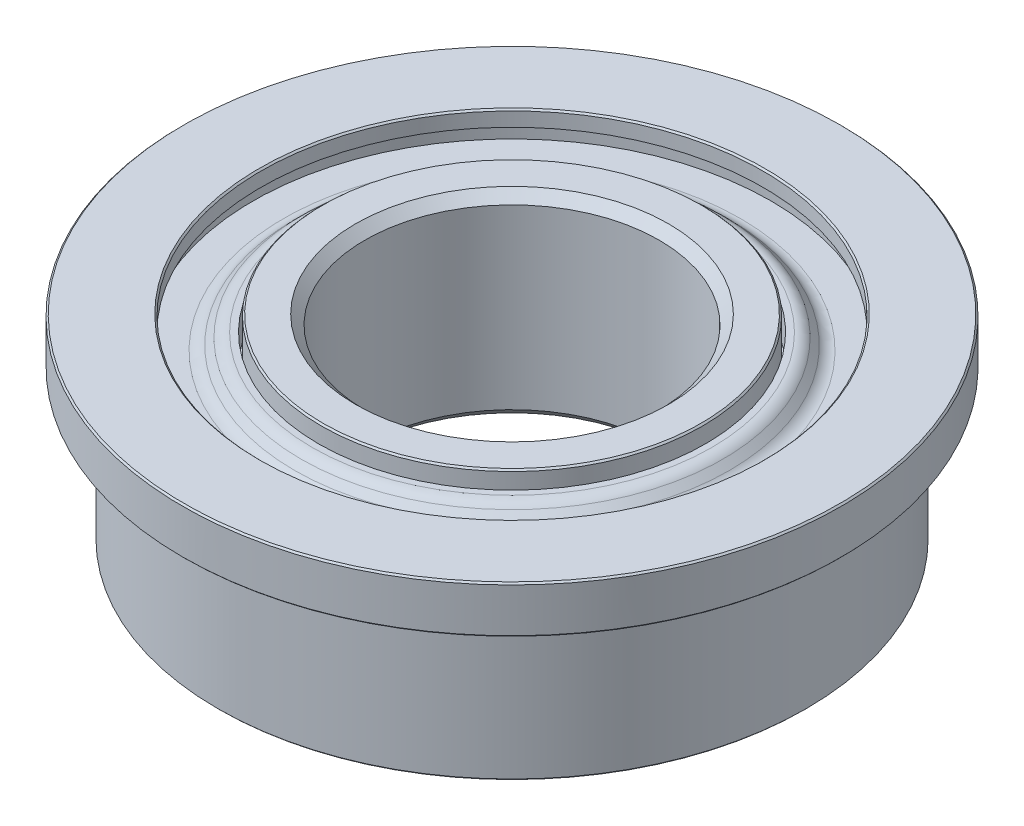
ISO-10303-21;
HEADER;
FILE_DESCRIPTION(('STEP AP214'),'2;1');
FILE_NAME('part.step','',(''),(''),'','','');
FILE_SCHEMA(('AUTOMOTIVE_DESIGN { 1 0 10303 214 1 1 1 1 }'));
ENDSEC;
DATA;
#1=APPLICATION_CONTEXT('core data for automotive mechanical design processes');
#2=APPLICATION_PROTOCOL_DEFINITION('international standard','automotive_design',2000,#1);
#3=PRODUCT_CONTEXT('',#1,'mechanical');
#4=PRODUCT('Part','Part','',(#3));
#5=PRODUCT_RELATED_PRODUCT_CATEGORY('part','',(#4));
#6=PRODUCT_DEFINITION_FORMATION('','',#4);
#7=PRODUCT_DEFINITION_CONTEXT('part definition',#1,'design');
#8=PRODUCT_DEFINITION('design','',#6,#7);
#9=PRODUCT_DEFINITION_SHAPE('','',#8);
#10=(LENGTH_UNIT() NAMED_UNIT(*) SI_UNIT(.MILLI.,.METRE.));
#11=(NAMED_UNIT(*) PLANE_ANGLE_UNIT() SI_UNIT($,.RADIAN.));
#12=(NAMED_UNIT(*) SI_UNIT($,.STERADIAN.) SOLID_ANGLE_UNIT());
#13=UNCERTAINTY_MEASURE_WITH_UNIT(LENGTH_MEASURE(1.E-05),#10,'distance_accuracy_value','');
#14=(GEOMETRIC_REPRESENTATION_CONTEXT(3) GLOBAL_UNCERTAINTY_ASSIGNED_CONTEXT((#13)) GLOBAL_UNIT_ASSIGNED_CONTEXT((#10,
#11,#12)) REPRESENTATION_CONTEXT('',''));
#15=CARTESIAN_POINT('',(0.,0.,0.));
#16=DIRECTION('',(0.,0.,1.));
#17=DIRECTION('',(1.,0.,0.));
#18=AXIS2_PLACEMENT_3D('',#15,#16,#17);
#19=CARTESIAN_POINT('',(0.,3.175,0.));
#20=DIRECTION('',(0.,1.,0.));
#21=DIRECTION('',(0.,0.,1.));
#22=AXIS2_PLACEMENT_3D('',#19,#20,#21);
#23=PLANE('',#22);
#24=CARTESIAN_POINT('',(0.,3.17499999994197,0.));
#25=DIRECTION('',(0.,1.,0.));
#26=DIRECTION('',(0.,0.,1.));
#27=AXIS2_PLACEMENT_3D('',#24,#25,#26);
#28=CIRCLE('',#27,2.5336499999753);
#29=CARTESIAN_POINT('',(0.,3.17499999994197,2.5336499999753));
#30=VERTEX_POINT('',#29);
#31=EDGE_CURVE('E254',#30,#30,#28,.F.);
#32=ORIENTED_EDGE('',*,*,#31,.T.);
#33=EDGE_LOOP('',(#32));
#34=FACE_BOUND('',#33,.T.);
#35=CARTESIAN_POINT('',(0.,3.17499999994197,0.));
#36=DIRECTION('',(0.,-1.,0.));
#37=DIRECTION('',(0.,0.,-1.));
#38=AXIS2_PLACEMENT_3D('',#35,#36,#37);
#39=CIRCLE('',#38,3.06070000004866);
#40=CARTESIAN_POINT('',(0.,3.17499999994197,-3.06070000004866));
#41=VERTEX_POINT('',#40);
#42=EDGE_CURVE('E20',#41,#41,#39,.T.);
#43=ORIENTED_EDGE('',*,*,#42,.F.);
#44=EDGE_LOOP('',(#43));
#45=FACE_BOUND('',#44,.T.);
#46=ADVANCED_FACE('F17',(#34,#45),#23,.T.);
#47=CARTESIAN_POINT('',(0.,3.14960000008568,0.));
#48=DIRECTION('',(0.,-1.,0.));
#49=DIRECTION('',(0.,0.,-1.));
#50=AXIS2_PLACEMENT_3D('',#47,#48,#49);
#51=CONICAL_SURFACE('',#50,3.0860999998481,0.785398162278483);
#52=ORIENTED_EDGE('',*,*,#42,.T.);
#53=EDGE_LOOP('',(#52));
#54=FACE_BOUND('',#53,.T.);
#55=CARTESIAN_POINT('',(0.,3.1496,0.));
#56=DIRECTION('',(0.,1.,0.));
#57=DIRECTION('',(0.,0.,1.));
#58=AXIS2_PLACEMENT_3D('',#55,#56,#57);
#59=CIRCLE('',#58,3.0861);
#60=CARTESIAN_POINT('',(0.,3.1496,3.0861));
#61=VERTEX_POINT('',#60);
#62=EDGE_CURVE('E256',#61,#61,#59,.F.);
#63=ORIENTED_EDGE('',*,*,#62,.F.);
#64=EDGE_LOOP('',(#63));
#65=FACE_BOUND('',#64,.T.);
#66=ADVANCED_FACE('F264',(#54,#65),#51,.T.);
#67=CARTESIAN_POINT('',(0.,3.17499999988513,0.));
#68=DIRECTION('',(0.,1.,0.));
#69=DIRECTION('',(0.,0.,1.));
#70=AXIS2_PLACEMENT_3D('',#67,#68,#69);
#71=CONICAL_SURFACE('',#70,2.53364999991845,0.785398163397448);
#72=ORIENTED_EDGE('',*,*,#31,.F.);
#73=EDGE_LOOP('',(#72));
#74=FACE_BOUND('',#73,.T.);
#75=CARTESIAN_POINT('',(0.,3.0226,0.));
#76=DIRECTION('',(0.,1.,0.));
#77=DIRECTION('',(0.,0.,1.));
#78=AXIS2_PLACEMENT_3D('',#75,#76,#77);
#79=CIRCLE('',#78,2.38125);
#80=CARTESIAN_POINT('',(0.,3.0226,2.38125));
#81=VERTEX_POINT('',#80);
#82=EDGE_CURVE('E253',#81,#81,#79,.F.);
#83=ORIENTED_EDGE('',*,*,#82,.T.);
#84=EDGE_LOOP('',(#83));
#85=FACE_BOUND('',#84,.T.);
#86=ADVANCED_FACE('F272',(#74,#85),#71,.F.);
#87=CARTESIAN_POINT('',(0.,2.921,0.));
#88=DIRECTION('',(0.,1.,0.));
#89=DIRECTION('',(0.,0.,1.));
#90=AXIS2_PLACEMENT_3D('',#87,#88,#89);
#91=CYLINDRICAL_SURFACE('',#90,3.0861);
#92=CARTESIAN_POINT('',(0.,2.413,0.));
#93=DIRECTION('',(0.,1.,0.));
#94=DIRECTION('',(0.,0.,1.));
#95=AXIS2_PLACEMENT_3D('',#92,#93,#94);
#96=CIRCLE('',#95,3.0861);
#97=CARTESIAN_POINT('',(0.,2.413,3.0861));
#98=VERTEX_POINT('',#97);
#99=EDGE_CURVE('E251',#98,#98,#96,.F.);
#100=ORIENTED_EDGE('',*,*,#99,.F.);
#101=EDGE_LOOP('',(#100));
#102=FACE_BOUND('',#101,.T.);
#103=ORIENTED_EDGE('',*,*,#62,.T.);
#104=EDGE_LOOP('',(#103));
#105=FACE_BOUND('',#104,.T.);
#106=ADVANCED_FACE('F607',(#102,#105),#91,.T.);
#107=CARTESIAN_POINT('',(0.,0.,0.));
#108=DIRECTION('',(0.,1.,0.));
#109=DIRECTION('',(0.,0.,1.));
#110=AXIS2_PLACEMENT_3D('',#107,#108,#109);
#111=CYLINDRICAL_SURFACE('',#110,2.38125);
#112=ORIENTED_EDGE('',*,*,#82,.F.);
#113=EDGE_LOOP('',(#112));
#114=FACE_BOUND('',#113,.T.);
#115=CARTESIAN_POINT('',(0.,0.15239999993355,0.));
#116=DIRECTION('',(0.,-1.,0.));
#117=DIRECTION('',(0.,0.,-1.));
#118=AXIS2_PLACEMENT_3D('',#115,#116,#117);
#119=CIRCLE('',#118,2.3812499999849);
#120=CARTESIAN_POINT('',(0.,0.15239999993355,-2.3812499999849));
#121=VERTEX_POINT('',#120);
#122=EDGE_CURVE('E250',#121,#121,#119,.T.);
#123=ORIENTED_EDGE('',*,*,#122,.T.);
#124=EDGE_LOOP('',(#123));
#125=FACE_BOUND('',#124,.T.);
#126=ADVANCED_FACE('F603',(#114,#125),#111,.F.);
#127=CARTESIAN_POINT('',(0.,2.413,0.));
#128=DIRECTION('',(0.,1.,0.));
#129=DIRECTION('',(0.,0.,1.));
#130=AXIS2_PLACEMENT_3D('',#127,#128,#129);
#131=PLANE('',#130);
#132=ORIENTED_EDGE('',*,*,#99,.T.);
#133=EDGE_LOOP('',(#132));
#134=FACE_BOUND('',#133,.T.);
#135=CARTESIAN_POINT('',(0.,2.413,0.));
#136=DIRECTION('',(0.,1.,0.));
#137=DIRECTION('',(0.,0.,1.));
#138=AXIS2_PLACEMENT_3D('',#135,#136,#137);
#139=CIRCLE('',#138,3.13102745681867);
#140=CARTESIAN_POINT('',(0.,2.413,3.13102745681867));
#141=VERTEX_POINT('',#140);
#142=EDGE_CURVE('E247',#141,#141,#139,.T.);
#143=ORIENTED_EDGE('',*,*,#142,.T.);
#144=EDGE_LOOP('',(#143));
#145=FACE_BOUND('',#144,.T.);
#146=ADVANCED_FACE('F606',(#134,#145),#131,.T.);
#147=CARTESIAN_POINT('',(0.,0.,0.));
#148=DIRECTION('',(0.,-1.,0.));
#149=DIRECTION('',(0.,0.,-1.));
#150=AXIS2_PLACEMENT_3D('',#147,#148,#149);
#151=CONICAL_SURFACE('',#150,2.53364999991845,0.785398163397448);
#152=CARTESIAN_POINT('',(0.,0.,0.));
#153=DIRECTION('',(0.,-1.,0.));
#154=DIRECTION('',(0.,0.,-1.));
#155=AXIS2_PLACEMENT_3D('',#152,#153,#154);
#156=CIRCLE('',#155,2.53364999991845);
#157=CARTESIAN_POINT('',(0.,0.,-2.53364999991845));
#158=VERTEX_POINT('',#157);
#159=EDGE_CURVE('E244',#158,#158,#156,.T.);
#160=ORIENTED_EDGE('',*,*,#159,.T.);
#161=EDGE_LOOP('',(#160));
#162=FACE_BOUND('',#161,.T.);
#163=ORIENTED_EDGE('',*,*,#122,.F.);
#164=EDGE_LOOP('',(#163));
#165=FACE_BOUND('',#164,.T.);
#166=ADVANCED_FACE('F611',(#162,#165),#151,.F.);
#167=CARTESIAN_POINT('',(0.,2.413,0.));
#168=DIRECTION('',(0.,1.,0.));
#169=DIRECTION('',(0.,0.,1.));
#170=AXIS2_PLACEMENT_3D('',#167,#168,#169);
#171=CYLINDRICAL_SURFACE('',#170,3.13102745681867);
#172=CARTESIAN_POINT('',(0.,2.921,0.));
#173=DIRECTION('',(0.,1.,0.));
#174=DIRECTION('',(0.,0.,1.));
#175=AXIS2_PLACEMENT_3D('',#172,#173,#174);
#176=CIRCLE('',#175,3.13102745681867);
#177=CARTESIAN_POINT('',(0.,2.921,3.13102745681867));
#178=VERTEX_POINT('',#177);
#179=EDGE_CURVE('E241',#178,#178,#176,.F.);
#180=ORIENTED_EDGE('',*,*,#179,.F.);
#181=EDGE_LOOP('',(#180));
#182=FACE_BOUND('',#181,.T.);
#183=ORIENTED_EDGE('',*,*,#142,.F.);
#184=EDGE_LOOP('',(#183));
#185=FACE_BOUND('',#184,.T.);
#186=ADVANCED_FACE('F613',(#182,#185),#171,.F.);
#187=CARTESIAN_POINT('',(0.,0.,0.));
#188=DIRECTION('',(0.,1.,0.));
#189=DIRECTION('',(0.,0.,1.));
#190=AXIS2_PLACEMENT_3D('',#187,#188,#189);
#191=PLANE('',#190);
#192=ORIENTED_EDGE('',*,*,#159,.F.);
#193=EDGE_LOOP('',(#192));
#194=FACE_BOUND('',#193,.T.);
#195=CARTESIAN_POINT('',(0.,5.6843418860808E-11,0.));
#196=DIRECTION('',(0.,1.,0.));
#197=DIRECTION('',(0.,0.,1.));
#198=AXIS2_PLACEMENT_3D('',#195,#196,#197);
#199=CIRCLE('',#198,3.06070000004866);
#200=CARTESIAN_POINT('',(0.,5.6843418860808E-11,3.06070000004866));
#201=VERTEX_POINT('',#200);
#202=EDGE_CURVE('E63',#201,#201,#199,.T.);
#203=ORIENTED_EDGE('',*,*,#202,.F.);
#204=EDGE_LOOP('',(#203));
#205=FACE_BOUND('',#204,.T.);
#206=ADVANCED_FACE('F620',(#194,#205),#191,.F.);
#207=CARTESIAN_POINT('',(0.,2.921,0.));
#208=DIRECTION('',(0.,1.,0.));
#209=DIRECTION('',(0.,0.,1.));
#210=AXIS2_PLACEMENT_3D('',#207,#208,#209);
#211=PLANE('',#210);
#212=ORIENTED_EDGE('',*,*,#179,.T.);
#213=EDGE_LOOP('',(#212));
#214=FACE_BOUND('',#213,.T.);
#215=CARTESIAN_POINT('',(0.,2.921,0.));
#216=DIRECTION('',(0.,-1.,0.));
#217=DIRECTION('',(0.,0.,-1.));
#218=AXIS2_PLACEMENT_3D('',#215,#216,#217);
#219=CIRCLE('',#218,3.23278991319175);
#220=CARTESIAN_POINT('',(0.,2.921,-3.23278991319175));
#221=VERTEX_POINT('',#220);
#222=CARTESIAN_POINT('',(0.,2.921,3.23278991319175));
#223=VERTEX_POINT('',#222);
#224=EDGE_CURVE('E58',#221,#223,#219,.T.);
#225=ORIENTED_EDGE('',*,*,#224,.F.);
#226=CARTESIAN_POINT('',(0.,2.921,0.));
#227=DIRECTION('',(0.,-1.,0.));
#228=DIRECTION('',(0.,0.,1.));
#229=AXIS2_PLACEMENT_3D('',#226,#227,#228);
#230=CIRCLE('',#229,3.23278991319175);
#231=EDGE_CURVE('E55',#223,#221,#230,.T.);
#232=ORIENTED_EDGE('',*,*,#231,.F.);
#233=EDGE_LOOP('',(#225,#232));
#234=FACE_BOUND('',#233,.T.);
#235=ADVANCED_FACE('F60',(#214,#234),#211,.T.);
#236=CARTESIAN_POINT('',(0.,0.0253999999131338,0.));
#237=DIRECTION('',(0.,1.,0.));
#238=DIRECTION('',(0.,0.,1.));
#239=AXIS2_PLACEMENT_3D('',#236,#237,#238);
#240=CONICAL_SURFACE('',#239,3.0860999998481,0.785398162278483);
#241=ORIENTED_EDGE('',*,*,#202,.T.);
#242=EDGE_LOOP('',(#241));
#243=FACE_BOUND('',#242,.T.);
#244=CARTESIAN_POINT('',(0.,0.0254000000000002,0.));
#245=DIRECTION('',(0.,-1.,0.));
#246=DIRECTION('',(0.,0.,-1.));
#247=AXIS2_PLACEMENT_3D('',#244,#245,#246);
#248=CIRCLE('',#247,3.0861);
#249=CARTESIAN_POINT('',(0.,0.0254000000000002,-3.0861));
#250=VERTEX_POINT('',#249);
#251=EDGE_CURVE('E68',#250,#250,#248,.F.);
#252=ORIENTED_EDGE('',*,*,#251,.F.);
#253=EDGE_LOOP('',(#252));
#254=FACE_BOUND('',#253,.T.);
#255=ADVANCED_FACE('F89',(#243,#254),#240,.T.);
#256=CARTESIAN_POINT('',(0.,2.667,0.));
#257=DIRECTION('',(0.,1.,0.));
#258=DIRECTION('',(0.,0.,1.));
#259=AXIS2_PLACEMENT_3D('',#256,#257,#258);
#260=TOROIDAL_SURFACE('',#259,3.23278991319175,0.254);
#261=CARTESIAN_POINT('',(0.,2.84660512244272,0.));
#262=DIRECTION('',(0.,-1.,0.));
#263=DIRECTION('',(0.,0.,-1.));
#264=AXIS2_PLACEMENT_3D('',#261,#262,#263);
#265=CIRCLE('',#264,3.41239503563884);
#266=CARTESIAN_POINT('',(0.,2.84660512244272,-3.41239503563884));
#267=VERTEX_POINT('',#266);
#268=EDGE_CURVE('E97',#267,#267,#265,.T.);
#269=ORIENTED_EDGE('',*,*,#268,.F.);
#270=EDGE_LOOP('',(#269));
#271=FACE_BOUND('',#270,.T.);
#272=ORIENTED_EDGE('',*,*,#231,.T.);
#273=ORIENTED_EDGE('',*,*,#224,.T.);
#274=EDGE_LOOP('',(#272,#273));
#275=FACE_BOUND('',#274,.T.);
#276=ADVANCED_FACE('F67',(#271,#275),#260,.T.);
#277=CARTESIAN_POINT('',(0.,0.254,0.));
#278=DIRECTION('',(0.,-1.,0.));
#279=DIRECTION('',(0.,0.,-1.));
#280=AXIS2_PLACEMENT_3D('',#277,#278,#279);
#281=CYLINDRICAL_SURFACE('',#280,3.0861);
#282=CARTESIAN_POINT('',(0.,0.762,0.));
#283=DIRECTION('',(0.,-1.,0.));
#284=DIRECTION('',(0.,0.,-1.));
#285=AXIS2_PLACEMENT_3D('',#282,#283,#284);
#286=CIRCLE('',#285,3.0861);
#287=CARTESIAN_POINT('',(0.,0.762,-3.0861));
#288=VERTEX_POINT('',#287);
#289=EDGE_CURVE('E99',#288,#288,#286,.F.);
#290=ORIENTED_EDGE('',*,*,#289,.F.);
#291=EDGE_LOOP('',(#290));
#292=FACE_BOUND('',#291,.T.);
#293=ORIENTED_EDGE('',*,*,#251,.T.);
#294=EDGE_LOOP('',(#293));
#295=FACE_BOUND('',#294,.T.);
#296=ADVANCED_FACE('F88',(#292,#295),#281,.T.);
#297=CARTESIAN_POINT('',(0.,2.74139487765979,0.));
#298=DIRECTION('',(0.,-1.,0.));
#299=DIRECTION('',(0.,0.,-1.));
#300=AXIS2_PLACEMENT_3D('',#297,#298,#299);
#301=CONICAL_SURFACE('',#300,3.51760528036493,0.785398163397448);
#302=ORIENTED_EDGE('',*,*,#268,.T.);
#303=EDGE_LOOP('',(#302));
#304=FACE_BOUND('',#303,.T.);
#305=CARTESIAN_POINT('',(0.,2.74139487757862,0.));
#306=DIRECTION('',(0.,1.,0.));
#307=DIRECTION('',(0.,0.,1.));
#308=AXIS2_PLACEMENT_3D('',#305,#306,#307);
#309=CIRCLE('',#308,3.51760528045587);
#310=CARTESIAN_POINT('',(0.,2.74139487757862,3.51760528045587));
#311=VERTEX_POINT('',#310);
#312=EDGE_CURVE('E103',#311,#311,#309,.T.);
#313=ORIENTED_EDGE('',*,*,#312,.T.);
#314=EDGE_LOOP('',(#313));
#315=FACE_BOUND('',#314,.T.);
#316=ADVANCED_FACE('F697',(#304,#315),#301,.T.);
#317=CARTESIAN_POINT('',(0.,0.762,0.));
#318=DIRECTION('',(0.,-1.,0.));
#319=DIRECTION('',(0.,0.,-1.));
#320=AXIS2_PLACEMENT_3D('',#317,#318,#319);
#321=PLANE('',#320);
#322=ORIENTED_EDGE('',*,*,#289,.T.);
#323=EDGE_LOOP('',(#322));
#324=FACE_BOUND('',#323,.T.);
#325=CARTESIAN_POINT('',(0.,0.762,0.));
#326=DIRECTION('',(0.,-1.,0.));
#327=DIRECTION('',(0.,0.,-1.));
#328=AXIS2_PLACEMENT_3D('',#325,#326,#327);
#329=CIRCLE('',#328,3.13102745681867);
#330=CARTESIAN_POINT('',(0.,0.762,-3.13102745681867));
#331=VERTEX_POINT('',#330);
#332=EDGE_CURVE('E138',#331,#331,#329,.T.);
#333=ORIENTED_EDGE('',*,*,#332,.T.);
#334=EDGE_LOOP('',(#333));
#335=FACE_BOUND('',#334,.T.);
#336=ADVANCED_FACE('F126',(#324,#335),#321,.T.);
#337=CARTESIAN_POINT('',(0.,2.921,0.));
#338=DIRECTION('',(0.,1.,0.));
#339=DIRECTION('',(0.,0.,1.));
#340=AXIS2_PLACEMENT_3D('',#337,#338,#339);
#341=TOROIDAL_SURFACE('',#340,3.69721040287726,0.254);
#342=CARTESIAN_POINT('',(0.,2.667,0.));
#343=DIRECTION('',(0.,1.,0.));
#344=DIRECTION('',(0.,0.,1.));
#345=AXIS2_PLACEMENT_3D('',#342,#343,#344);
#346=CIRCLE('',#345,3.69721040287726);
#347=CARTESIAN_POINT('',(0.,2.667,-3.69721040287726));
#348=VERTEX_POINT('',#347);
#349=CARTESIAN_POINT('',(0.,2.667,3.69721040287726));
#350=VERTEX_POINT('',#349);
#351=EDGE_CURVE('E142',#348,#350,#346,.F.);
#352=ORIENTED_EDGE('',*,*,#351,.F.);
#353=CARTESIAN_POINT('',(0.,2.667,0.));
#354=DIRECTION('',(0.,1.,0.));
#355=DIRECTION('',(0.,0.,-1.));
#356=AXIS2_PLACEMENT_3D('',#353,#354,#355);
#357=CIRCLE('',#356,3.69721040287726);
#358=EDGE_CURVE('E152',#350,#348,#357,.F.);
#359=ORIENTED_EDGE('',*,*,#358,.F.);
#360=EDGE_LOOP('',(#352,#359));
#361=FACE_BOUND('',#360,.T.);
#362=ORIENTED_EDGE('',*,*,#312,.F.);
#363=EDGE_LOOP('',(#362));
#364=FACE_BOUND('',#363,.T.);
#365=ADVANCED_FACE('F114',(#361,#364),#341,.F.);
#366=CARTESIAN_POINT('',(0.,0.762,0.));
#367=DIRECTION('',(0.,-1.,0.));
#368=DIRECTION('',(0.,0.,-1.));
#369=AXIS2_PLACEMENT_3D('',#366,#367,#368);
#370=CYLINDRICAL_SURFACE('',#369,3.13102745681867);
#371=CARTESIAN_POINT('',(0.,0.254,0.));
#372=DIRECTION('',(0.,-1.,0.));
#373=DIRECTION('',(0.,0.,-1.));
#374=AXIS2_PLACEMENT_3D('',#371,#372,#373);
#375=CIRCLE('',#374,3.13102745681867);
#376=CARTESIAN_POINT('',(0.,0.254,-3.13102745681867));
#377=VERTEX_POINT('',#376);
#378=EDGE_CURVE('E154',#377,#377,#375,.F.);
#379=ORIENTED_EDGE('',*,*,#378,.F.);
#380=EDGE_LOOP('',(#379));
#381=FACE_BOUND('',#380,.T.);
#382=ORIENTED_EDGE('',*,*,#332,.F.);
#383=EDGE_LOOP('',(#382));
#384=FACE_BOUND('',#383,.T.);
#385=ADVANCED_FACE('F125',(#381,#384),#370,.F.);
#386=CARTESIAN_POINT('',(0.,2.667,0.));
#387=DIRECTION('',(0.,1.,0.));
#388=DIRECTION('',(0.,0.,1.));
#389=AXIS2_PLACEMENT_3D('',#386,#387,#388);
#390=PLANE('',#389);
#391=ORIENTED_EDGE('',*,*,#358,.T.);
#392=ORIENTED_EDGE('',*,*,#351,.T.);
#393=EDGE_LOOP('',(#391,#392));
#394=FACE_BOUND('',#393,.T.);
#395=CARTESIAN_POINT('',(0.,2.667,0.));
#396=DIRECTION('',(0.,1.,0.));
#397=DIRECTION('',(0.,0.,1.));
#398=AXIS2_PLACEMENT_3D('',#395,#396,#397);
#399=CIRCLE('',#398,4.191);
#400=CARTESIAN_POINT('',(0.,2.667,4.191));
#401=VERTEX_POINT('',#400);
#402=EDGE_CURVE('E228',#401,#401,#399,.T.);
#403=ORIENTED_EDGE('',*,*,#402,.T.);
#404=EDGE_LOOP('',(#403));
#405=FACE_BOUND('',#404,.T.);
#406=ADVANCED_FACE('F156',(#394,#405),#390,.T.);
#407=CARTESIAN_POINT('',(0.,0.254,0.));
#408=DIRECTION('',(0.,-1.,0.));
#409=DIRECTION('',(0.,0.,-1.));
#410=AXIS2_PLACEMENT_3D('',#407,#408,#409);
#411=PLANE('',#410);
#412=ORIENTED_EDGE('',*,*,#378,.T.);
#413=EDGE_LOOP('',(#412));
#414=FACE_BOUND('',#413,.T.);
#415=CARTESIAN_POINT('',(0.,0.254,0.));
#416=DIRECTION('',(0.,1.,0.));
#417=DIRECTION('',(0.,0.,1.));
#418=AXIS2_PLACEMENT_3D('',#415,#416,#417);
#419=CIRCLE('',#418,3.23278991319172);
#420=CARTESIAN_POINT('',(0.,0.254,3.23278991319172));
#421=VERTEX_POINT('',#420);
#422=CARTESIAN_POINT('',(0.,0.254,-3.23278991319172));
#423=VERTEX_POINT('',#422);
#424=EDGE_CURVE('E227',#421,#423,#419,.T.);
#425=ORIENTED_EDGE('',*,*,#424,.F.);
#426=CARTESIAN_POINT('',(0.,0.254,0.));
#427=DIRECTION('',(0.,1.,0.));
#428=DIRECTION('',(0.,0.,-1.));
#429=AXIS2_PLACEMENT_3D('',#426,#427,#428);
#430=CIRCLE('',#429,3.23278991319172);
#431=EDGE_CURVE('E200',#423,#421,#430,.T.);
#432=ORIENTED_EDGE('',*,*,#431,.F.);
#433=EDGE_LOOP('',(#425,#432));
#434=FACE_BOUND('',#433,.T.);
#435=ADVANCED_FACE('F174',(#414,#434),#411,.T.);
#436=CARTESIAN_POINT('',(0.,2.667,0.));
#437=DIRECTION('',(0.,1.,0.));
#438=DIRECTION('',(0.,0.,1.));
#439=AXIS2_PLACEMENT_3D('',#436,#437,#438);
#440=CYLINDRICAL_SURFACE('',#439,4.191);
#441=CARTESIAN_POINT('',(0.,2.921,0.));
#442=DIRECTION('',(0.,1.,0.));
#443=DIRECTION('',(0.,0.,1.));
#444=AXIS2_PLACEMENT_3D('',#441,#442,#443);
#445=CIRCLE('',#444,4.191);
#446=CARTESIAN_POINT('',(0.,2.921,4.191));
#447=VERTEX_POINT('',#446);
#448=EDGE_CURVE('E225',#447,#447,#445,.T.);
#449=ORIENTED_EDGE('',*,*,#448,.T.);
#450=EDGE_LOOP('',(#449));
#451=FACE_BOUND('',#450,.T.);
#452=ORIENTED_EDGE('',*,*,#402,.F.);
#453=EDGE_LOOP('',(#452));
#454=FACE_BOUND('',#453,.T.);
#455=ADVANCED_FACE('F179',(#451,#454),#440,.F.);
#456=CARTESIAN_POINT('',(0.,0.508,0.));
#457=DIRECTION('',(0.,-1.,0.));
#458=DIRECTION('',(0.,0.,-1.));
#459=AXIS2_PLACEMENT_3D('',#456,#457,#458);
#460=TOROIDAL_SURFACE('',#459,3.23278991319172,0.254);
#461=CARTESIAN_POINT('',(0.,0.328394877612936,0.));
#462=DIRECTION('',(0.,1.,0.));
#463=DIRECTION('',(0.,0.,1.));
#464=AXIS2_PLACEMENT_3D('',#461,#462,#463);
#465=CIRCLE('',#464,3.41239503558199);
#466=CARTESIAN_POINT('',(0.,0.328394877612936,3.41239503558199));
#467=VERTEX_POINT('',#466);
#468=EDGE_CURVE('E222',#467,#467,#465,.T.);
#469=ORIENTED_EDGE('',*,*,#468,.F.);
#470=EDGE_LOOP('',(#469));
#471=FACE_BOUND('',#470,.T.);
#472=ORIENTED_EDGE('',*,*,#431,.T.);
#473=ORIENTED_EDGE('',*,*,#424,.T.);
#474=EDGE_LOOP('',(#472,#473));
#475=FACE_BOUND('',#474,.T.);
#476=ADVANCED_FACE('F203',(#471,#475),#460,.T.);
#477=CARTESIAN_POINT('',(0.,2.921,0.));
#478=DIRECTION('',(0.,1.,0.));
#479=DIRECTION('',(0.,0.,1.));
#480=AXIS2_PLACEMENT_3D('',#477,#478,#479);
#481=PLANE('',#480);
#482=CARTESIAN_POINT('',(0.,2.921,0.));
#483=DIRECTION('',(0.,1.,0.));
#484=DIRECTION('',(0.,0.,1.));
#485=AXIS2_PLACEMENT_3D('',#482,#483,#484);
#486=CIRCLE('',#485,4.064);
#487=CARTESIAN_POINT('',(0.,2.921,4.064));
#488=VERTEX_POINT('',#487);
#489=EDGE_CURVE('E224',#488,#488,#486,.T.);
#490=ORIENTED_EDGE('',*,*,#489,.T.);
#491=EDGE_LOOP('',(#490));
#492=FACE_BOUND('',#491,.T.);
#493=ORIENTED_EDGE('',*,*,#448,.F.);
#494=EDGE_LOOP('',(#493));
#495=FACE_BOUND('',#494,.T.);
#496=ADVANCED_FACE('F213',(#492,#495),#481,.F.);
#497=CARTESIAN_POINT('',(0.,0.433605122452718,0.));
#498=DIRECTION('',(0.,1.,0.));
#499=DIRECTION('',(0.,0.,1.));
#500=AXIS2_PLACEMENT_3D('',#497,#498,#499);
#501=CONICAL_SURFACE('',#500,3.51760528042178,0.785398163397448);
#502=ORIENTED_EDGE('',*,*,#468,.T.);
#503=EDGE_LOOP('',(#502));
#504=FACE_BOUND('',#503,.T.);
#505=CARTESIAN_POINT('',(0.,0.433605122421389,0.));
#506=DIRECTION('',(0.,-1.,0.));
#507=DIRECTION('',(0.,0.,-1.));
#508=AXIS2_PLACEMENT_3D('',#505,#506,#507);
#509=CIRCLE('',#508,3.51760528045588);
#510=CARTESIAN_POINT('',(0.,0.433605122421389,-3.51760528045588));
#511=VERTEX_POINT('',#510);
#512=EDGE_CURVE('E364',#511,#511,#509,.T.);
#513=ORIENTED_EDGE('',*,*,#512,.T.);
#514=EDGE_LOOP('',(#513));
#515=FACE_BOUND('',#514,.T.);
#516=ADVANCED_FACE('F396',(#504,#515),#501,.T.);
#517=CARTESIAN_POINT('',(0.,2.921,0.));
#518=DIRECTION('',(0.,1.,0.));
#519=DIRECTION('',(0.,0.,1.));
#520=AXIS2_PLACEMENT_3D('',#517,#518,#519);
#521=CYLINDRICAL_SURFACE('',#520,4.064);
#522=CARTESIAN_POINT('',(0.,3.14960000002884,0.));
#523=DIRECTION('',(0.,1.,0.));
#524=DIRECTION('',(0.,0.,1.));
#525=AXIS2_PLACEMENT_3D('',#522,#523,#524);
#526=CIRCLE('',#525,4.06400000002805);
#527=CARTESIAN_POINT('',(0.,3.14960000002884,4.06400000002805));
#528=VERTEX_POINT('',#527);
#529=EDGE_CURVE('E362',#528,#528,#526,.T.);
#530=ORIENTED_EDGE('',*,*,#529,.T.);
#531=EDGE_LOOP('',(#530));
#532=FACE_BOUND('',#531,.T.);
#533=ORIENTED_EDGE('',*,*,#489,.F.);
#534=EDGE_LOOP('',(#533));
#535=FACE_BOUND('',#534,.T.);
#536=ADVANCED_FACE('F383',(#532,#535),#521,.F.);
#537=CARTESIAN_POINT('',(0.,0.254,0.));
#538=DIRECTION('',(0.,-1.,0.));
#539=DIRECTION('',(0.,0.,-1.));
#540=AXIS2_PLACEMENT_3D('',#537,#538,#539);
#541=TOROIDAL_SURFACE('',#540,3.69721040287726,0.254);
#542=CARTESIAN_POINT('',(0.,0.508,0.));
#543=DIRECTION('',(0.,-1.,0.));
#544=DIRECTION('',(0.,0.,-1.));
#545=AXIS2_PLACEMENT_3D('',#542,#543,#544);
#546=CIRCLE('',#545,3.69721040287726);
#547=CARTESIAN_POINT('',(0.,0.508,3.69721040287726));
#548=VERTEX_POINT('',#547);
#549=CARTESIAN_POINT('',(0.,0.508,-3.69721040287726));
#550=VERTEX_POINT('',#549);
#551=EDGE_CURVE('E34',#548,#550,#546,.F.);
#552=ORIENTED_EDGE('',*,*,#551,.F.);
#553=CARTESIAN_POINT('',(0.,0.508,0.));
#554=DIRECTION('',(0.,-1.,0.));
#555=DIRECTION('',(0.,0.,1.));
#556=AXIS2_PLACEMENT_3D('',#553,#554,#555);
#557=CIRCLE('',#556,3.69721040287726);
#558=EDGE_CURVE('E357',#550,#548,#557,.F.);
#559=ORIENTED_EDGE('',*,*,#558,.F.);
#560=EDGE_LOOP('',(#552,#559));
#561=FACE_BOUND('',#560,.T.);
#562=ORIENTED_EDGE('',*,*,#512,.F.);
#563=EDGE_LOOP('',(#562));
#564=FACE_BOUND('',#563,.T.);
#565=ADVANCED_FACE('F374',(#561,#564),#541,.F.);
#566=CARTESIAN_POINT('',(0.,3.17499999988513,0.));
#567=DIRECTION('',(0.,1.,0.));
#568=DIRECTION('',(0.,0.,1.));
#569=AXIS2_PLACEMENT_3D('',#566,#567,#568);
#570=CONICAL_SURFACE('',#569,4.08939999988434,0.785398163397448);
#571=CARTESIAN_POINT('',(0.,3.17499999994197,0.));
#572=DIRECTION('',(0.,1.,0.));
#573=DIRECTION('',(0.,0.,1.));
#574=AXIS2_PLACEMENT_3D('',#571,#572,#573);
#575=CIRCLE('',#574,4.08939999994118);
#576=CARTESIAN_POINT('',(0.,3.17499999994197,4.08939999994118));
#577=VERTEX_POINT('',#576);
#578=EDGE_CURVE('E358',#577,#577,#575,.F.);
#579=ORIENTED_EDGE('',*,*,#578,.F.);
#580=EDGE_LOOP('',(#579));
#581=FACE_BOUND('',#580,.T.);
#582=ORIENTED_EDGE('',*,*,#529,.F.);
#583=EDGE_LOOP('',(#582));
#584=FACE_BOUND('',#583,.T.);
#585=ADVANCED_FACE('F337',(#581,#584),#570,.F.);
#586=CARTESIAN_POINT('',(0.,0.508,0.));
#587=DIRECTION('',(0.,-1.,0.));
#588=DIRECTION('',(0.,0.,-1.));
#589=AXIS2_PLACEMENT_3D('',#586,#587,#588);
#590=PLANE('',#589);
#591=ORIENTED_EDGE('',*,*,#558,.T.);
#592=ORIENTED_EDGE('',*,*,#551,.T.);
#593=EDGE_LOOP('',(#591,#592));
#594=FACE_BOUND('',#593,.T.);
#595=CARTESIAN_POINT('',(0.,0.508,0.));
#596=DIRECTION('',(0.,-1.,0.));
#597=DIRECTION('',(0.,0.,-1.));
#598=AXIS2_PLACEMENT_3D('',#595,#596,#597);
#599=CIRCLE('',#598,4.191);
#600=CARTESIAN_POINT('',(0.,0.508,-4.191));
#601=VERTEX_POINT('',#600);
#602=EDGE_CURVE('E360',#601,#601,#599,.T.);
#603=ORIENTED_EDGE('',*,*,#602,.T.);
#604=EDGE_LOOP('',(#603));
#605=FACE_BOUND('',#604,.T.);
#606=ADVANCED_FACE('F332',(#594,#605),#590,.T.);
#607=CARTESIAN_POINT('',(0.,3.175,0.));
#608=DIRECTION('',(0.,1.,0.));
#609=DIRECTION('',(0.,0.,1.));
#610=AXIS2_PLACEMENT_3D('',#607,#608,#609);
#611=PLANE('',#610);
#612=ORIENTED_EDGE('',*,*,#578,.T.);
#613=EDGE_LOOP('',(#612));
#614=FACE_BOUND('',#613,.T.);
#615=CARTESIAN_POINT('',(0.,3.17500000005566,0.));
#616=DIRECTION('',(0.,-1.,0.));
#617=DIRECTION('',(0.,0.,-1.));
#618=AXIS2_PLACEMENT_3D('',#615,#616,#617);
#619=CIRCLE('',#618,5.30859999992117);
#620=CARTESIAN_POINT('',(0.,3.17500000005566,-5.30859999992117));
#621=VERTEX_POINT('',#620);
#622=EDGE_CURVE('E557',#621,#621,#619,.T.);
#623=ORIENTED_EDGE('',*,*,#622,.F.);
#624=EDGE_LOOP('',(#623));
#625=FACE_BOUND('',#624,.T.);
#626=ADVANCED_FACE('F328',(#614,#625),#611,.T.);
#627=CARTESIAN_POINT('',(0.,0.508,0.));
#628=DIRECTION('',(0.,-1.,0.));
#629=DIRECTION('',(0.,0.,-1.));
#630=AXIS2_PLACEMENT_3D('',#627,#628,#629);
#631=CYLINDRICAL_SURFACE('',#630,4.191);
#632=CARTESIAN_POINT('',(0.,0.254,0.));
#633=DIRECTION('',(0.,-1.,0.));
#634=DIRECTION('',(0.,0.,-1.));
#635=AXIS2_PLACEMENT_3D('',#632,#633,#634);
#636=CIRCLE('',#635,4.191);
#637=CARTESIAN_POINT('',(0.,0.254,-4.191));
#638=VERTEX_POINT('',#637);
#639=EDGE_CURVE('E558',#638,#638,#636,.T.);
#640=ORIENTED_EDGE('',*,*,#639,.T.);
#641=EDGE_LOOP('',(#640));
#642=FACE_BOUND('',#641,.T.);
#643=ORIENTED_EDGE('',*,*,#602,.F.);
#644=EDGE_LOOP('',(#643));
#645=FACE_BOUND('',#644,.T.);
#646=ADVANCED_FACE('F324',(#642,#645),#631,.F.);
#647=CARTESIAN_POINT('',(0.,3.14960000002884,0.));
#648=DIRECTION('',(0.,-1.,0.));
#649=DIRECTION('',(0.,0.,-1.));
#650=AXIS2_PLACEMENT_3D('',#647,#648,#649);
#651=CONICAL_SURFACE('',#650,5.33399999994799,0.785398163397448);
#652=ORIENTED_EDGE('',*,*,#622,.T.);
#653=EDGE_LOOP('',(#652));
#654=FACE_BOUND('',#653,.T.);
#655=CARTESIAN_POINT('',(0.,3.1496,0.));
#656=DIRECTION('',(0.,-1.,0.));
#657=DIRECTION('',(0.,0.,-1.));
#658=AXIS2_PLACEMENT_3D('',#655,#656,#657);
#659=CIRCLE('',#658,5.334);
#660=CARTESIAN_POINT('',(0.,3.1496,-5.334));
#661=VERTEX_POINT('',#660);
#662=EDGE_CURVE('E561',#661,#661,#659,.T.);
#663=ORIENTED_EDGE('',*,*,#662,.F.);
#664=EDGE_LOOP('',(#663));
#665=FACE_BOUND('',#664,.T.);
#666=ADVANCED_FACE('F320',(#654,#665),#651,.T.);
#667=CARTESIAN_POINT('',(0.,0.254,0.));
#668=DIRECTION('',(0.,-1.,0.));
#669=DIRECTION('',(0.,0.,-1.));
#670=AXIS2_PLACEMENT_3D('',#667,#668,#669);
#671=PLANE('',#670);
#672=CARTESIAN_POINT('',(0.,0.254,0.));
#673=DIRECTION('',(0.,-1.,0.));
#674=DIRECTION('',(0.,0.,-1.));
#675=AXIS2_PLACEMENT_3D('',#672,#673,#674);
#676=CIRCLE('',#675,4.064);
#677=CARTESIAN_POINT('',(0.,0.254,-4.064));
#678=VERTEX_POINT('',#677);
#679=EDGE_CURVE('E566',#678,#678,#676,.T.);
#680=ORIENTED_EDGE('',*,*,#679,.T.);
#681=EDGE_LOOP('',(#680));
#682=FACE_BOUND('',#681,.T.);
#683=ORIENTED_EDGE('',*,*,#639,.F.);
#684=EDGE_LOOP('',(#683));
#685=FACE_BOUND('',#684,.T.);
#686=ADVANCED_FACE('F316',(#682,#685),#671,.F.);
#687=CARTESIAN_POINT('',(0.,3.175,0.));
#688=DIRECTION('',(0.,-1.,0.));
#689=DIRECTION('',(0.,0.,-1.));
#690=AXIS2_PLACEMENT_3D('',#687,#688,#689);
#691=CYLINDRICAL_SURFACE('',#690,5.334);
#692=ORIENTED_EDGE('',*,*,#662,.T.);
#693=EDGE_LOOP('',(#692));
#694=FACE_BOUND('',#693,.T.);
#695=CARTESIAN_POINT('',(0.,2.43840000001683,0.));
#696=DIRECTION('',(0.,1.,0.));
#697=DIRECTION('',(0.,0.,1.));
#698=AXIS2_PLACEMENT_3D('',#695,#696,#697);
#699=CIRCLE('',#698,5.33400000006168);
#700=CARTESIAN_POINT('',(0.,2.43840000001683,5.33400000006168));
#701=VERTEX_POINT('',#700);
#702=EDGE_CURVE('E569',#701,#701,#699,.F.);
#703=ORIENTED_EDGE('',*,*,#702,.F.);
#704=EDGE_LOOP('',(#703));
#705=FACE_BOUND('',#704,.T.);
#706=ADVANCED_FACE('F312',(#694,#705),#691,.T.);
#707=CARTESIAN_POINT('',(0.,0.254,0.));
#708=DIRECTION('',(0.,-1.,0.));
#709=DIRECTION('',(0.,0.,-1.));
#710=AXIS2_PLACEMENT_3D('',#707,#708,#709);
#711=CYLINDRICAL_SURFACE('',#710,4.064);
#712=CARTESIAN_POINT('',(0.,0.0254000000268206,0.));
#713=DIRECTION('',(0.,-1.,0.));
#714=DIRECTION('',(0.,0.,-1.));
#715=AXIS2_PLACEMENT_3D('',#712,#713,#714);
#716=CIRCLE('',#715,4.0639999999712);
#717=CARTESIAN_POINT('',(0.,0.0254000000268206,-4.0639999999712));
#718=VERTEX_POINT('',#717);
#719=EDGE_CURVE('E574',#718,#718,#716,.T.);
#720=ORIENTED_EDGE('',*,*,#719,.T.);
#721=EDGE_LOOP('',(#720));
#722=FACE_BOUND('',#721,.T.);
#723=ORIENTED_EDGE('',*,*,#679,.F.);
#724=EDGE_LOOP('',(#723));
#725=FACE_BOUND('',#724,.T.);
#726=ADVANCED_FACE('F308',(#722,#725),#711,.F.);
#727=CARTESIAN_POINT('',(0.,2.43840000001683,0.));
#728=DIRECTION('',(0.,1.,0.));
#729=DIRECTION('',(0.,0.,1.));
#730=AXIS2_PLACEMENT_3D('',#727,#728,#729);
#731=CONICAL_SURFACE('',#730,5.33400000006168,0.785398164516413);
#732=CARTESIAN_POINT('',(0.,2.41300000004685,0.));
#733=DIRECTION('',(0.,1.,0.));
#734=DIRECTION('',(0.,0.,1.));
#735=AXIS2_PLACEMENT_3D('',#732,#733,#734);
#736=CIRCLE('',#735,5.30860000003486);
#737=CARTESIAN_POINT('',(0.,2.41300000004685,5.30860000003486));
#738=VERTEX_POINT('',#737);
#739=EDGE_CURVE('E570',#738,#738,#736,.T.);
#740=ORIENTED_EDGE('',*,*,#739,.T.);
#741=EDGE_LOOP('',(#740));
#742=FACE_BOUND('',#741,.T.);
#743=ORIENTED_EDGE('',*,*,#702,.T.);
#744=EDGE_LOOP('',(#743));
#745=FACE_BOUND('',#744,.T.);
#746=ADVANCED_FACE('F304',(#742,#745),#731,.T.);
#747=CARTESIAN_POINT('',(0.,0.,0.));
#748=DIRECTION('',(0.,-1.,0.));
#749=DIRECTION('',(0.,0.,-1.));
#750=AXIS2_PLACEMENT_3D('',#747,#748,#749);
#751=CONICAL_SURFACE('',#750,4.08939999999802,0.785398163397448);
#752=CARTESIAN_POINT('',(0.,0.,0.));
#753=DIRECTION('',(0.,-1.,0.));
#754=DIRECTION('',(0.,0.,-1.));
#755=AXIS2_PLACEMENT_3D('',#752,#753,#754);
#756=CIRCLE('',#755,4.08939999999802);
#757=CARTESIAN_POINT('',(0.,0.,-4.08939999999802));
#758=VERTEX_POINT('',#757);
#759=EDGE_CURVE('E573',#758,#758,#756,.T.);
#760=ORIENTED_EDGE('',*,*,#759,.T.);
#761=EDGE_LOOP('',(#760));
#762=FACE_BOUND('',#761,.T.);
#763=ORIENTED_EDGE('',*,*,#719,.F.);
#764=EDGE_LOOP('',(#763));
#765=FACE_BOUND('',#764,.T.);
#766=ADVANCED_FACE('F300',(#762,#765),#751,.F.);
#767=CARTESIAN_POINT('',(0.,2.413,0.));
#768=DIRECTION('',(0.,1.,0.));
#769=DIRECTION('',(0.,0.,1.));
#770=AXIS2_PLACEMENT_3D('',#767,#768,#769);
#771=PLANE('',#770);
#772=CARTESIAN_POINT('',(0.,2.413,0.));
#773=DIRECTION('',(0.,1.,0.));
#774=DIRECTION('',(0.,0.,1.));
#775=AXIS2_PLACEMENT_3D('',#772,#773,#774);
#776=CIRCLE('',#775,4.5085);
#777=CARTESIAN_POINT('',(0.,2.413,4.5085));
#778=VERTEX_POINT('',#777);
#779=EDGE_CURVE('E577',#778,#778,#776,.F.);
#780=ORIENTED_EDGE('',*,*,#779,.F.);
#781=EDGE_LOOP('',(#780));
#782=FACE_BOUND('',#781,.T.);
#783=ORIENTED_EDGE('',*,*,#739,.F.);
#784=EDGE_LOOP('',(#783));
#785=FACE_BOUND('',#784,.T.);
#786=ADVANCED_FACE('F296',(#782,#785),#771,.F.);
#787=CARTESIAN_POINT('',(0.,0.,0.));
#788=DIRECTION('',(0.,1.,0.));
#789=DIRECTION('',(0.,0.,1.));
#790=AXIS2_PLACEMENT_3D('',#787,#788,#789);
#791=PLANE('',#790);
#792=ORIENTED_EDGE('',*,*,#759,.F.);
#793=EDGE_LOOP('',(#792));
#794=FACE_BOUND('',#793,.T.);
#795=CARTESIAN_POINT('',(0.,0.,0.));
#796=DIRECTION('',(0.,1.,0.));
#797=DIRECTION('',(0.,0.,1.));
#798=AXIS2_PLACEMENT_3D('',#795,#796,#797);
#799=CIRCLE('',#798,4.73709999994298);
#800=CARTESIAN_POINT('',(0.,0.,4.73709999994298));
#801=VERTEX_POINT('',#800);
#802=EDGE_CURVE('E580',#801,#801,#799,.T.);
#803=ORIENTED_EDGE('',*,*,#802,.F.);
#804=EDGE_LOOP('',(#803));
#805=FACE_BOUND('',#804,.T.);
#806=ADVANCED_FACE('F292',(#794,#805),#791,.F.);
#807=CARTESIAN_POINT('',(0.,0.,0.));
#808=DIRECTION('',(0.,1.,0.));
#809=DIRECTION('',(0.,0.,1.));
#810=AXIS2_PLACEMENT_3D('',#807,#808,#809);
#811=CYLINDRICAL_SURFACE('',#810,4.5085);
#812=CARTESIAN_POINT('',(0.,2.1082,0.));
#813=DIRECTION('',(0.,1.,0.));
#814=DIRECTION('',(0.,0.,1.));
#815=AXIS2_PLACEMENT_3D('',#812,#813,#814);
#816=CIRCLE('',#815,4.5085);
#817=CARTESIAN_POINT('',(0.,2.1082,4.5085));
#818=VERTEX_POINT('',#817);
#819=EDGE_CURVE('E583',#818,#818,#816,.F.);
#820=ORIENTED_EDGE('',*,*,#819,.F.);
#821=EDGE_LOOP('',(#820));
#822=FACE_BOUND('',#821,.T.);
#823=ORIENTED_EDGE('',*,*,#779,.T.);
#824=EDGE_LOOP('',(#823));
#825=FACE_BOUND('',#824,.T.);
#826=ADVANCED_FACE('F288',(#822,#825),#811,.T.);
#827=CARTESIAN_POINT('',(0.,0.0254000001405075,0.));
#828=DIRECTION('',(0.,1.,0.));
#829=DIRECTION('',(0.,0.,1.));
#830=AXIS2_PLACEMENT_3D('',#827,#828,#829);
#831=CONICAL_SURFACE('',#830,4.76250000002665,0.785398162278483);
#832=ORIENTED_EDGE('',*,*,#802,.T.);
#833=EDGE_LOOP('',(#832));
#834=FACE_BOUND('',#833,.T.);
#835=CARTESIAN_POINT('',(0.,0.0254000000000009,0.));
#836=DIRECTION('',(0.,-1.,0.));
#837=DIRECTION('',(0.,0.,-1.));
#838=AXIS2_PLACEMENT_3D('',#835,#836,#837);
#839=CIRCLE('',#838,4.7625);
#840=CARTESIAN_POINT('',(0.,0.0254000000000009,-4.7625));
#841=VERTEX_POINT('',#840);
#842=EDGE_CURVE('E26',#841,#841,#839,.F.);
#843=ORIENTED_EDGE('',*,*,#842,.F.);
#844=EDGE_LOOP('',(#843));
#845=FACE_BOUND('',#844,.T.);
#846=ADVANCED_FACE('F281',(#834,#845),#831,.T.);
#847=CARTESIAN_POINT('',(4.7625,2.1082,0.));
#848=DIRECTION('',(0.,1.,0.));
#849=DIRECTION('',(0.,0.,1.));
#850=AXIS2_PLACEMENT_3D('',#847,#848,#849);
#851=PLANE('',#850);
#852=ORIENTED_EDGE('',*,*,#819,.T.);
#853=EDGE_LOOP('',(#852));
#854=FACE_BOUND('',#853,.T.);
#855=CARTESIAN_POINT('',(0.,2.1082,0.));
#856=DIRECTION('',(0.,-1.,0.));
#857=DIRECTION('',(0.,0.,-1.));
#858=AXIS2_PLACEMENT_3D('',#855,#856,#857);
#859=CIRCLE('',#858,4.7625);
#860=CARTESIAN_POINT('',(0.,2.1082,-4.7625));
#861=VERTEX_POINT('',#860);
#862=EDGE_CURVE('E11',#861,#861,#859,.T.);
#863=ORIENTED_EDGE('',*,*,#862,.F.);
#864=EDGE_LOOP('',(#863));
#865=FACE_BOUND('',#864,.T.);
#866=ADVANCED_FACE('F275',(#854,#865),#851,.T.);
#867=CARTESIAN_POINT('',(0.,2.413,0.));
#868=DIRECTION('',(0.,-1.,0.));
#869=DIRECTION('',(0.,0.,-1.));
#870=AXIS2_PLACEMENT_3D('',#867,#868,#869);
#871=CYLINDRICAL_SURFACE('',#870,4.7625);
#872=ORIENTED_EDGE('',*,*,#862,.T.);
#873=EDGE_LOOP('',(#872));
#874=FACE_BOUND('',#873,.T.);
#875=ORIENTED_EDGE('',*,*,#842,.T.);
#876=EDGE_LOOP('',(#875));
#877=FACE_BOUND('',#876,.T.);
#878=ADVANCED_FACE('F273',(#874,#877),#871,.T.);
#879=CLOSED_SHELL('',(#46,#66,#86,#106,#126,#146,#166,#186,#206,#235,#255,#276,#296,#316,#336,
#365,#385,#406,#435,#455,#476,#496,#516,#536,#565,#585,#606,#626,#646,#666,#686,#706,#726,#746,
#766,#786,#806,#826,#846,#866,#878));
#880=MANIFOLD_SOLID_BREP('B1',#879);
#881=ADVANCED_BREP_SHAPE_REPRESENTATION('',(#18,#880),#14);
#882=SHAPE_DEFINITION_REPRESENTATION(#9,#881);
ENDSEC;
END-ISO-10303-21;
